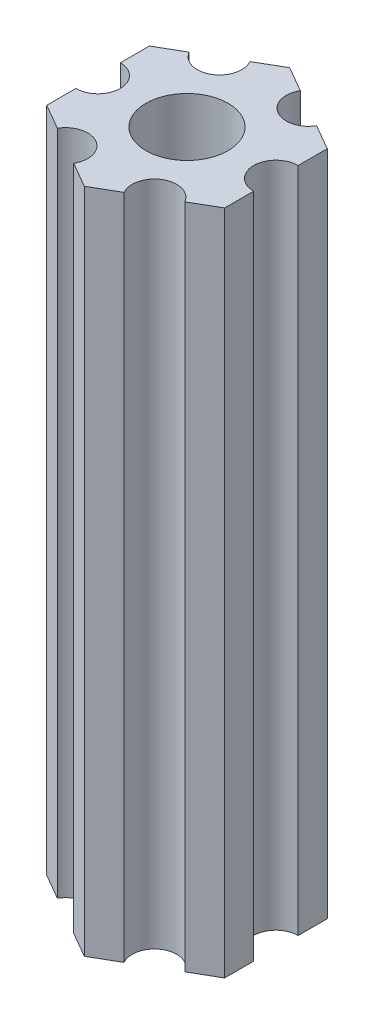
ISO-10303-21;
HEADER;
FILE_DESCRIPTION(('STEP AP214'),'2;1');
FILE_NAME('part.step','',(''),(''),'','','');
FILE_SCHEMA(('AUTOMOTIVE_DESIGN { 1 0 10303 214 1 1 1 1 }'));
ENDSEC;
DATA;
#1=APPLICATION_CONTEXT('core data for automotive mechanical design processes');
#2=APPLICATION_PROTOCOL_DEFINITION('international standard','automotive_design',2000,#1);
#3=PRODUCT_CONTEXT('',#1,'mechanical');
#4=PRODUCT('Part','Part','',(#3));
#5=PRODUCT_RELATED_PRODUCT_CATEGORY('part','',(#4));
#6=PRODUCT_DEFINITION_FORMATION('','',#4);
#7=PRODUCT_DEFINITION_CONTEXT('part definition',#1,'design');
#8=PRODUCT_DEFINITION('design','',#6,#7);
#9=PRODUCT_DEFINITION_SHAPE('','',#8);
#10=(LENGTH_UNIT() NAMED_UNIT(*) SI_UNIT(.MILLI.,.METRE.));
#11=(NAMED_UNIT(*) PLANE_ANGLE_UNIT() SI_UNIT($,.RADIAN.));
#12=(NAMED_UNIT(*) SI_UNIT($,.STERADIAN.) SOLID_ANGLE_UNIT());
#13=UNCERTAINTY_MEASURE_WITH_UNIT(LENGTH_MEASURE(1.E-05),#10,'distance_accuracy_value','');
#14=(GEOMETRIC_REPRESENTATION_CONTEXT(3) GLOBAL_UNCERTAINTY_ASSIGNED_CONTEXT((#13)) GLOBAL_UNIT_ASSIGNED_CONTEXT((#10,
#11,#12)) REPRESENTATION_CONTEXT('',''));
#15=CARTESIAN_POINT('',(0.,0.,0.));
#16=DIRECTION('',(0.,0.,1.));
#17=DIRECTION('',(1.,0.,0.));
#18=AXIS2_PLACEMENT_3D('',#15,#16,#17);
#19=CARTESIAN_POINT('',(3.175,-47.625,5.49926131403119));
#20=DIRECTION('',(0.,1.,0.));
#21=DIRECTION('',(-0.866025403784439,0.,0.5));
#22=AXIS2_PLACEMENT_3D('',#19,#20,#21);
#23=CYLINDRICAL_SURFACE('',#22,1.5875);
#24=DIRECTION('',(0.,-1.,0.));
#25=VECTOR('',#24,1.);
#26=CARTESIAN_POINT('',(1.8001846714922,-47.625,6.29301131403118));
#27=LINE('',#26,#25);
#28=CARTESIAN_POINT('',(1.8001846714922,0.,6.29301131403119));
#29=VERTEX_POINT('',#28);
#30=CARTESIAN_POINT('',(1.8001846714922,-47.625,6.29301131403119));
#31=VERTEX_POINT('',#30);
#32=EDGE_CURVE('E380',#29,#31,#27,.T.);
#33=ORIENTED_EDGE('',*,*,#32,.T.);
#34=CARTESIAN_POINT('',(3.175,-47.625,5.49926131403119));
#35=DIRECTION('',(0.,-1.,0.));
#36=DIRECTION('',(0.866025403784439,0.,-0.5));
#37=AXIS2_PLACEMENT_3D('',#34,#35,#36);
#38=CIRCLE('',#37,1.5875);
#39=CARTESIAN_POINT('',(4.5498153285078,-47.625,4.70551131403118));
#40=VERTEX_POINT('',#39);
#41=EDGE_CURVE('E247',#31,#40,#38,.T.);
#42=ORIENTED_EDGE('',*,*,#41,.T.);
#43=DIRECTION('',(0.,1.,0.));
#44=VECTOR('',#43,1.);
#45=CARTESIAN_POINT('',(4.5498153285078,-47.625,4.70551131403118));
#46=LINE('',#45,#44);
#47=CARTESIAN_POINT('',(4.5498153285078,0.,4.70551131403119));
#48=VERTEX_POINT('',#47);
#49=EDGE_CURVE('E387',#40,#48,#46,.T.);
#50=ORIENTED_EDGE('',*,*,#49,.T.);
#51=CARTESIAN_POINT('',(3.175,0.,5.49926131403119));
#52=DIRECTION('',(0.,-1.,0.));
#53=DIRECTION('',(0.866025403784439,0.,-0.5));
#54=AXIS2_PLACEMENT_3D('',#51,#52,#53);
#55=CIRCLE('',#54,1.5875);
#56=EDGE_CURVE('E308',#29,#48,#55,.T.);
#57=ORIENTED_EDGE('',*,*,#56,.F.);
#58=EDGE_LOOP('',(#33,#42,#50,#57));
#59=FACE_BOUND('',#58,.T.);
#60=ADVANCED_FACE('F17',(#59),#23,.F.);
#61=CARTESIAN_POINT('',(-3.175,-47.625,5.49926131403119));
#62=DIRECTION('',(0.,1.,0.));
#63=DIRECTION('',(-0.866025403784439,0.,-0.5));
#64=AXIS2_PLACEMENT_3D('',#61,#62,#63);
#65=CYLINDRICAL_SURFACE('',#64,1.5875);
#66=DIRECTION('',(0.,-1.,0.));
#67=VECTOR('',#66,1.);
#68=CARTESIAN_POINT('',(-4.5498153285078,-47.625,4.70551131403119));
#69=LINE('',#68,#67);
#70=CARTESIAN_POINT('',(-4.5498153285078,0.,4.70551131403119));
#71=VERTEX_POINT('',#70);
#72=CARTESIAN_POINT('',(-4.5498153285078,-47.625,4.70551131403119));
#73=VERTEX_POINT('',#72);
#74=EDGE_CURVE('E232',#71,#73,#69,.T.);
#75=ORIENTED_EDGE('',*,*,#74,.T.);
#76=CARTESIAN_POINT('',(-3.175,-47.625,5.49926131403119));
#77=DIRECTION('',(0.,-1.,0.));
#78=DIRECTION('',(0.866025403784439,0.,0.5));
#79=AXIS2_PLACEMENT_3D('',#76,#77,#78);
#80=CIRCLE('',#79,1.5875);
#81=CARTESIAN_POINT('',(-1.8001846714922,-47.625,6.29301131403119));
#82=VERTEX_POINT('',#81);
#83=EDGE_CURVE('E284',#73,#82,#80,.T.);
#84=ORIENTED_EDGE('',*,*,#83,.T.);
#85=DIRECTION('',(0.,1.,0.));
#86=VECTOR('',#85,1.);
#87=CARTESIAN_POINT('',(-1.8001846714922,-47.625,6.29301131403119));
#88=LINE('',#87,#86);
#89=CARTESIAN_POINT('',(-1.8001846714922,0.,6.29301131403119));
#90=VERTEX_POINT('',#89);
#91=EDGE_CURVE('E236',#82,#90,#88,.T.);
#92=ORIENTED_EDGE('',*,*,#91,.T.);
#93=CARTESIAN_POINT('',(-3.175,0.,5.49926131403119));
#94=DIRECTION('',(0.,-1.,0.));
#95=DIRECTION('',(0.866025403784439,0.,0.5));
#96=AXIS2_PLACEMENT_3D('',#93,#94,#95);
#97=CIRCLE('',#96,1.5875);
#98=EDGE_CURVE('E11',#71,#90,#97,.T.);
#99=ORIENTED_EDGE('',*,*,#98,.F.);
#100=EDGE_LOOP('',(#75,#84,#92,#99));
#101=FACE_BOUND('',#100,.T.);
#102=ADVANCED_FACE('F453',(#101),#65,.F.);
#103=CARTESIAN_POINT('',(-6.35,-47.625,0.));
#104=DIRECTION('',(0.,1.,0.));
#105=DIRECTION('',(0.,0.,-1.));
#106=AXIS2_PLACEMENT_3D('',#103,#104,#105);
#107=CYLINDRICAL_SURFACE('',#106,1.5875);
#108=DIRECTION('',(0.,-1.,0.));
#109=VECTOR('',#108,1.);
#110=CARTESIAN_POINT('',(-6.35,-47.625,-1.5875));
#111=LINE('',#110,#109);
#112=CARTESIAN_POINT('',(-6.35,0.,-1.5875));
#113=VERTEX_POINT('',#112);
#114=CARTESIAN_POINT('',(-6.35,-47.625,-1.5875));
#115=VERTEX_POINT('',#114);
#116=EDGE_CURVE('E192',#113,#115,#111,.T.);
#117=ORIENTED_EDGE('',*,*,#116,.T.);
#118=CARTESIAN_POINT('',(-6.35,-47.625,0.));
#119=DIRECTION('',(0.,-1.,0.));
#120=DIRECTION('',(0.,0.,1.));
#121=AXIS2_PLACEMENT_3D('',#118,#119,#120);
#122=CIRCLE('',#121,1.5875);
#123=CARTESIAN_POINT('',(-6.35,-47.625,1.5875));
#124=VERTEX_POINT('',#123);
#125=EDGE_CURVE('E287',#115,#124,#122,.T.);
#126=ORIENTED_EDGE('',*,*,#125,.T.);
#127=DIRECTION('',(0.,1.,0.));
#128=VECTOR('',#127,1.);
#129=CARTESIAN_POINT('',(-6.35,-47.625,1.5875));
#130=LINE('',#129,#128);
#131=CARTESIAN_POINT('',(-6.35,0.,1.5875));
#132=VERTEX_POINT('',#131);
#133=EDGE_CURVE('E194',#124,#132,#130,.T.);
#134=ORIENTED_EDGE('',*,*,#133,.T.);
#135=CARTESIAN_POINT('',(-6.35,0.,0.));
#136=DIRECTION('',(0.,-1.,0.));
#137=DIRECTION('',(0.,0.,1.));
#138=AXIS2_PLACEMENT_3D('',#135,#136,#137);
#139=CIRCLE('',#138,1.5875);
#140=EDGE_CURVE('E25',#113,#132,#139,.T.);
#141=ORIENTED_EDGE('',*,*,#140,.F.);
#142=EDGE_LOOP('',(#117,#126,#134,#141));
#143=FACE_BOUND('',#142,.T.);
#144=ADVANCED_FACE('F190',(#143),#107,.F.);
#145=CARTESIAN_POINT('',(-3.175,-47.625,-5.49926131403118));
#146=DIRECTION('',(0.,1.,0.));
#147=DIRECTION('',(0.866025403784439,0.,-0.5));
#148=AXIS2_PLACEMENT_3D('',#145,#146,#147);
#149=CYLINDRICAL_SURFACE('',#148,1.5875);
#150=DIRECTION('',(0.,-1.,0.));
#151=VECTOR('',#150,1.);
#152=CARTESIAN_POINT('',(-1.8001846714922,-47.625,-6.29301131403118));
#153=LINE('',#152,#151);
#154=CARTESIAN_POINT('',(-1.8001846714922,0.,-6.29301131403118));
#155=VERTEX_POINT('',#154);
#156=CARTESIAN_POINT('',(-1.8001846714922,-47.625,-6.29301131403118));
#157=VERTEX_POINT('',#156);
#158=EDGE_CURVE('E256',#155,#157,#153,.T.);
#159=ORIENTED_EDGE('',*,*,#158,.T.);
#160=CARTESIAN_POINT('',(-3.175,-47.625,-5.49926131403118));
#161=DIRECTION('',(0.,-1.,0.));
#162=DIRECTION('',(-0.866025403784439,0.,0.5));
#163=AXIS2_PLACEMENT_3D('',#160,#161,#162);
#164=CIRCLE('',#163,1.5875);
#165=CARTESIAN_POINT('',(-4.5498153285078,-47.625,-4.70551131403118));
#166=VERTEX_POINT('',#165);
#167=EDGE_CURVE('E349',#157,#166,#164,.T.);
#168=ORIENTED_EDGE('',*,*,#167,.T.);
#169=DIRECTION('',(0.,1.,0.));
#170=VECTOR('',#169,1.);
#171=CARTESIAN_POINT('',(-4.5498153285078,-47.625,-4.70551131403118));
#172=LINE('',#171,#170);
#173=CARTESIAN_POINT('',(-4.5498153285078,0.,-4.70551131403118));
#174=VERTEX_POINT('',#173);
#175=EDGE_CURVE('E283',#166,#174,#172,.T.);
#176=ORIENTED_EDGE('',*,*,#175,.T.);
#177=CARTESIAN_POINT('',(-3.175,0.,-5.49926131403118));
#178=DIRECTION('',(0.,-1.,0.));
#179=DIRECTION('',(-0.866025403784439,0.,0.5));
#180=AXIS2_PLACEMENT_3D('',#177,#178,#179);
#181=CIRCLE('',#180,1.5875);
#182=EDGE_CURVE('E198',#155,#174,#181,.T.);
#183=ORIENTED_EDGE('',*,*,#182,.F.);
#184=EDGE_LOOP('',(#159,#168,#176,#183));
#185=FACE_BOUND('',#184,.T.);
#186=ADVANCED_FACE('F370',(#185),#149,.F.);
#187=CARTESIAN_POINT('',(3.175,-47.625,-5.49926131403119));
#188=DIRECTION('',(0.,1.,0.));
#189=DIRECTION('',(0.866025403784439,0.,0.5));
#190=AXIS2_PLACEMENT_3D('',#187,#188,#189);
#191=CYLINDRICAL_SURFACE('',#190,1.5875);
#192=DIRECTION('',(0.,-1.,0.));
#193=VECTOR('',#192,1.);
#194=CARTESIAN_POINT('',(4.5498153285078,-47.625,-4.70551131403119));
#195=LINE('',#194,#193);
#196=CARTESIAN_POINT('',(4.5498153285078,0.,-4.70551131403119));
#197=VERTEX_POINT('',#196);
#198=CARTESIAN_POINT('',(4.5498153285078,-47.625,-4.70551131403119));
#199=VERTEX_POINT('',#198);
#200=EDGE_CURVE('E305',#197,#199,#195,.T.);
#201=ORIENTED_EDGE('',*,*,#200,.T.);
#202=CARTESIAN_POINT('',(3.175,-47.625,-5.49926131403119));
#203=DIRECTION('',(0.,-1.,0.));
#204=DIRECTION('',(-0.866025403784439,0.,-0.5));
#205=AXIS2_PLACEMENT_3D('',#202,#203,#204);
#206=CIRCLE('',#205,1.5875);
#207=CARTESIAN_POINT('',(1.8001846714922,-47.625,-6.29301131403119));
#208=VERTEX_POINT('',#207);
#209=EDGE_CURVE('E352',#199,#208,#206,.T.);
#210=ORIENTED_EDGE('',*,*,#209,.T.);
#211=DIRECTION('',(0.,1.,0.));
#212=VECTOR('',#211,1.);
#213=CARTESIAN_POINT('',(1.8001846714922,-47.625,-6.29301131403119));
#214=LINE('',#213,#212);
#215=CARTESIAN_POINT('',(1.8001846714922,0.,-6.29301131403119));
#216=VERTEX_POINT('',#215);
#217=EDGE_CURVE('E327',#208,#216,#214,.T.);
#218=ORIENTED_EDGE('',*,*,#217,.T.);
#219=CARTESIAN_POINT('',(3.175,0.,-5.49926131403119));
#220=DIRECTION('',(0.,-1.,0.));
#221=DIRECTION('',(-0.866025403784439,0.,-0.5));
#222=AXIS2_PLACEMENT_3D('',#219,#220,#221);
#223=CIRCLE('',#222,1.5875);
#224=EDGE_CURVE('E359',#197,#216,#223,.T.);
#225=ORIENTED_EDGE('',*,*,#224,.F.);
#226=EDGE_LOOP('',(#201,#210,#218,#225));
#227=FACE_BOUND('',#226,.T.);
#228=ADVANCED_FACE('F419',(#227),#191,.F.);
#229=CARTESIAN_POINT('',(6.35,-47.625,0.));
#230=DIRECTION('',(0.,1.,0.));
#231=DIRECTION('',(0.,0.,1.));
#232=AXIS2_PLACEMENT_3D('',#229,#230,#231);
#233=CYLINDRICAL_SURFACE('',#232,1.5875);
#234=DIRECTION('',(0.,-1.,0.));
#235=VECTOR('',#234,1.);
#236=CARTESIAN_POINT('',(6.35,-47.625,1.5875));
#237=LINE('',#236,#235);
#238=CARTESIAN_POINT('',(6.35,0.,1.5875));
#239=VERTEX_POINT('',#238);
#240=CARTESIAN_POINT('',(6.35,-47.625,1.5875));
#241=VERTEX_POINT('',#240);
#242=EDGE_CURVE('E319',#239,#241,#237,.T.);
#243=ORIENTED_EDGE('',*,*,#242,.T.);
#244=CARTESIAN_POINT('',(6.35,-47.625,0.));
#245=DIRECTION('',(0.,-1.,0.));
#246=DIRECTION('',(0.,0.,-1.));
#247=AXIS2_PLACEMENT_3D('',#244,#245,#246);
#248=CIRCLE('',#247,1.5875);
#249=CARTESIAN_POINT('',(6.35,-47.625,-1.5875));
#250=VERTEX_POINT('',#249);
#251=EDGE_CURVE('E318',#241,#250,#248,.T.);
#252=ORIENTED_EDGE('',*,*,#251,.T.);
#253=DIRECTION('',(0.,1.,0.));
#254=VECTOR('',#253,1.);
#255=CARTESIAN_POINT('',(6.35,-47.625,-1.5875));
#256=LINE('',#255,#254);
#257=CARTESIAN_POINT('',(6.35,0.,-1.5875));
#258=VERTEX_POINT('',#257);
#259=EDGE_CURVE('E291',#250,#258,#256,.T.);
#260=ORIENTED_EDGE('',*,*,#259,.T.);
#261=CARTESIAN_POINT('',(6.35,0.,0.));
#262=DIRECTION('',(0.,-1.,0.));
#263=DIRECTION('',(0.,0.,-1.));
#264=AXIS2_PLACEMENT_3D('',#261,#262,#263);
#265=CIRCLE('',#264,1.5875);
#266=EDGE_CURVE('E311',#239,#258,#265,.T.);
#267=ORIENTED_EDGE('',*,*,#266,.F.);
#268=EDGE_LOOP('',(#243,#252,#260,#267));
#269=FACE_BOUND('',#268,.T.);
#270=ADVANCED_FACE('F430',(#269),#233,.F.);
#271=CARTESIAN_POINT('',(0.,-47.625,0.));
#272=DIRECTION('',(0.,1.,0.));
#273=DIRECTION('',(0.,0.,1.));
#274=AXIS2_PLACEMENT_3D('',#271,#272,#273);
#275=CYLINDRICAL_SURFACE('',#274,2.9337);
#276=CARTESIAN_POINT('',(0.,0.,0.));
#277=DIRECTION('',(0.,-1.,0.));
#278=DIRECTION('',(0.,0.,-1.));
#279=AXIS2_PLACEMENT_3D('',#276,#277,#278);
#280=CIRCLE('',#279,2.9337);
#281=CARTESIAN_POINT('',(0.,0.,-2.9337));
#282=VERTEX_POINT('',#281);
#283=EDGE_CURVE('E35',#282,#282,#280,.T.);
#284=ORIENTED_EDGE('',*,*,#283,.F.);
#285=EDGE_LOOP('',(#284));
#286=FACE_BOUND('',#285,.T.);
#287=CARTESIAN_POINT('',(0.,-47.625,0.));
#288=DIRECTION('',(0.,-1.,0.));
#289=DIRECTION('',(0.,0.,-1.));
#290=AXIS2_PLACEMENT_3D('',#287,#288,#289);
#291=CIRCLE('',#290,2.9337);
#292=CARTESIAN_POINT('',(0.,-47.625,-2.9337));
#293=VERTEX_POINT('',#292);
#294=EDGE_CURVE('E42',#293,#293,#291,.T.);
#295=ORIENTED_EDGE('',*,*,#294,.T.);
#296=EDGE_LOOP('',(#295));
#297=FACE_BOUND('',#296,.T.);
#298=ADVANCED_FACE('F496',(#286,#297),#275,.F.);
#299=CARTESIAN_POINT('',(0.,0.,0.));
#300=DIRECTION('',(0.,-1.,0.));
#301=DIRECTION('',(0.,0.,-1.));
#302=AXIS2_PLACEMENT_3D('',#299,#300,#301);
#303=PLANE('',#302);
#304=DIRECTION('',(-0.866025403784439,0.,0.5));
#305=VECTOR('',#304,1.);
#306=CARTESIAN_POINT('',(3.175,0.,5.49926131403118));
#307=LINE('',#306,#305);
#308=CARTESIAN_POINT('',(0.,0.,7.33234841870825));
#309=VERTEX_POINT('',#308);
#310=EDGE_CURVE('E383',#29,#309,#307,.T.);
#311=ORIENTED_EDGE('',*,*,#310,.F.);
#312=ORIENTED_EDGE('',*,*,#56,.T.);
#313=DIRECTION('',(-0.866025403784439,0.,0.5));
#314=VECTOR('',#313,1.);
#315=CARTESIAN_POINT('',(3.175,0.,5.49926131403118));
#316=LINE('',#315,#314);
#317=CARTESIAN_POINT('',(6.35,0.,3.66617420935412));
#318=VERTEX_POINT('',#317);
#319=EDGE_CURVE('E229',#318,#48,#316,.T.);
#320=ORIENTED_EDGE('',*,*,#319,.F.);
#321=DIRECTION('',(0.,0.,1.));
#322=VECTOR('',#321,1.);
#323=CARTESIAN_POINT('',(6.35,0.,0.));
#324=LINE('',#323,#322);
#325=EDGE_CURVE('E292',#239,#318,#324,.T.);
#326=ORIENTED_EDGE('',*,*,#325,.F.);
#327=ORIENTED_EDGE('',*,*,#266,.T.);
#328=DIRECTION('',(0.,0.,1.));
#329=VECTOR('',#328,1.);
#330=CARTESIAN_POINT('',(6.35,0.,0.));
#331=LINE('',#330,#329);
#332=CARTESIAN_POINT('',(6.35,0.,-3.66617420935413));
#333=VERTEX_POINT('',#332);
#334=EDGE_CURVE('E248',#333,#258,#331,.T.);
#335=ORIENTED_EDGE('',*,*,#334,.F.);
#336=DIRECTION('',(0.866025403784439,0.,0.5));
#337=VECTOR('',#336,1.);
#338=CARTESIAN_POINT('',(3.175,0.,-5.49926131403119));
#339=LINE('',#338,#337);
#340=EDGE_CURVE('E300',#197,#333,#339,.T.);
#341=ORIENTED_EDGE('',*,*,#340,.F.);
#342=ORIENTED_EDGE('',*,*,#224,.T.);
#343=DIRECTION('',(0.866025403784439,0.,0.5));
#344=VECTOR('',#343,1.);
#345=CARTESIAN_POINT('',(3.175,0.,-5.49926131403119));
#346=LINE('',#345,#344);
#347=CARTESIAN_POINT('',(0.,0.,-7.33234841870825));
#348=VERTEX_POINT('',#347);
#349=EDGE_CURVE('E323',#348,#216,#346,.T.);
#350=ORIENTED_EDGE('',*,*,#349,.F.);
#351=DIRECTION('',(0.866025403784439,0.,-0.5));
#352=VECTOR('',#351,1.);
#353=CARTESIAN_POINT('',(-3.175,0.,-5.49926131403119));
#354=LINE('',#353,#352);
#355=EDGE_CURVE('E259',#155,#348,#354,.T.);
#356=ORIENTED_EDGE('',*,*,#355,.F.);
#357=ORIENTED_EDGE('',*,*,#182,.T.);
#358=DIRECTION('',(0.866025403784439,0.,-0.5));
#359=VECTOR('',#358,1.);
#360=CARTESIAN_POINT('',(-3.175,0.,-5.49926131403119));
#361=LINE('',#360,#359);
#362=CARTESIAN_POINT('',(-6.35,0.,-3.66617420935412));
#363=VERTEX_POINT('',#362);
#364=EDGE_CURVE('E204',#363,#174,#361,.T.);
#365=ORIENTED_EDGE('',*,*,#364,.F.);
#366=DIRECTION('',(0.,0.,-1.));
#367=VECTOR('',#366,1.);
#368=CARTESIAN_POINT('',(-6.35,0.,0.));
#369=LINE('',#368,#367);
#370=EDGE_CURVE('E200',#113,#363,#369,.T.);
#371=ORIENTED_EDGE('',*,*,#370,.F.);
#372=ORIENTED_EDGE('',*,*,#140,.T.);
#373=DIRECTION('',(0.,0.,-1.));
#374=VECTOR('',#373,1.);
#375=CARTESIAN_POINT('',(-6.35,0.,0.));
#376=LINE('',#375,#374);
#377=CARTESIAN_POINT('',(-6.35,0.,3.66617420935413));
#378=VERTEX_POINT('',#377);
#379=EDGE_CURVE('E260',#378,#132,#376,.T.);
#380=ORIENTED_EDGE('',*,*,#379,.F.);
#381=DIRECTION('',(-0.866025403784439,0.,-0.5));
#382=VECTOR('',#381,1.);
#383=CARTESIAN_POINT('',(-3.175,0.,5.49926131403119));
#384=LINE('',#383,#382);
#385=EDGE_CURVE('E240',#71,#378,#384,.T.);
#386=ORIENTED_EDGE('',*,*,#385,.F.);
#387=ORIENTED_EDGE('',*,*,#98,.T.);
#388=DIRECTION('',(-0.866025403784439,0.,-0.5));
#389=VECTOR('',#388,1.);
#390=CARTESIAN_POINT('',(-3.175,0.,5.49926131403119));
#391=LINE('',#390,#389);
#392=EDGE_CURVE('E216',#309,#90,#391,.T.);
#393=ORIENTED_EDGE('',*,*,#392,.F.);
#394=EDGE_LOOP('',(#311,#312,#320,#326,#327,#335,#341,#342,#350,#356,#357,#365,#371,#372,#380,
#386,#387,#393));
#395=FACE_BOUND('',#394,.T.);
#396=ORIENTED_EDGE('',*,*,#283,.T.);
#397=EDGE_LOOP('',(#396));
#398=FACE_BOUND('',#397,.T.);
#399=ADVANCED_FACE('F202',(#395,#398),#303,.F.);
#400=CARTESIAN_POINT('',(0.,-47.625,0.));
#401=DIRECTION('',(0.,-1.,0.));
#402=DIRECTION('',(0.,0.,-1.));
#403=AXIS2_PLACEMENT_3D('',#400,#401,#402);
#404=PLANE('',#403);
#405=ORIENTED_EDGE('',*,*,#41,.F.);
#406=DIRECTION('',(-0.866025403784439,0.,0.5));
#407=VECTOR('',#406,1.);
#408=CARTESIAN_POINT('',(3.175,-47.625,5.49926131403118));
#409=LINE('',#408,#407);
#410=CARTESIAN_POINT('',(0.,-47.625,7.33234841870825));
#411=VERTEX_POINT('',#410);
#412=EDGE_CURVE('E392',#31,#411,#409,.T.);
#413=ORIENTED_EDGE('',*,*,#412,.T.);
#414=DIRECTION('',(-0.866025403784439,0.,-0.5));
#415=VECTOR('',#414,1.);
#416=CARTESIAN_POINT('',(-3.175,-47.625,5.49926131403119));
#417=LINE('',#416,#415);
#418=EDGE_CURVE('E223',#411,#82,#417,.T.);
#419=ORIENTED_EDGE('',*,*,#418,.T.);
#420=ORIENTED_EDGE('',*,*,#83,.F.);
#421=DIRECTION('',(-0.866025403784439,0.,-0.5));
#422=VECTOR('',#421,1.);
#423=CARTESIAN_POINT('',(-3.175,-47.625,5.49926131403119));
#424=LINE('',#423,#422);
#425=CARTESIAN_POINT('',(-6.35,-47.625,3.66617420935413));
#426=VERTEX_POINT('',#425);
#427=EDGE_CURVE('E252',#73,#426,#424,.T.);
#428=ORIENTED_EDGE('',*,*,#427,.T.);
#429=DIRECTION('',(0.,0.,-1.));
#430=VECTOR('',#429,1.);
#431=CARTESIAN_POINT('',(-6.35,-47.625,0.));
#432=LINE('',#431,#430);
#433=EDGE_CURVE('E266',#426,#124,#432,.T.);
#434=ORIENTED_EDGE('',*,*,#433,.T.);
#435=ORIENTED_EDGE('',*,*,#125,.F.);
#436=DIRECTION('',(0.,0.,-1.));
#437=VECTOR('',#436,1.);
#438=CARTESIAN_POINT('',(-6.35,-47.625,0.));
#439=LINE('',#438,#437);
#440=CARTESIAN_POINT('',(-6.35,-47.625,-3.66617420935412));
#441=VERTEX_POINT('',#440);
#442=EDGE_CURVE('E214',#115,#441,#439,.T.);
#443=ORIENTED_EDGE('',*,*,#442,.T.);
#444=DIRECTION('',(0.866025403784439,0.,-0.5));
#445=VECTOR('',#444,1.);
#446=CARTESIAN_POINT('',(-3.175,-47.625,-5.49926131403119));
#447=LINE('',#446,#445);
#448=EDGE_CURVE('E296',#441,#166,#447,.T.);
#449=ORIENTED_EDGE('',*,*,#448,.T.);
#450=ORIENTED_EDGE('',*,*,#167,.F.);
#451=DIRECTION('',(0.866025403784439,0.,-0.5));
#452=VECTOR('',#451,1.);
#453=CARTESIAN_POINT('',(-3.175,-47.625,-5.49926131403119));
#454=LINE('',#453,#452);
#455=CARTESIAN_POINT('',(0.,-47.625,-7.33234841870825));
#456=VERTEX_POINT('',#455);
#457=EDGE_CURVE('E279',#157,#456,#454,.T.);
#458=ORIENTED_EDGE('',*,*,#457,.T.);
#459=DIRECTION('',(0.866025403784439,0.,0.5));
#460=VECTOR('',#459,1.);
#461=CARTESIAN_POINT('',(3.175,-47.625,-5.49926131403119));
#462=LINE('',#461,#460);
#463=EDGE_CURVE('E331',#456,#208,#462,.T.);
#464=ORIENTED_EDGE('',*,*,#463,.T.);
#465=ORIENTED_EDGE('',*,*,#209,.F.);
#466=DIRECTION('',(0.866025403784439,0.,0.5));
#467=VECTOR('',#466,1.);
#468=CARTESIAN_POINT('',(3.175,-47.625,-5.49926131403119));
#469=LINE('',#468,#467);
#470=CARTESIAN_POINT('',(6.35,-47.625,-3.66617420935413));
#471=VERTEX_POINT('',#470);
#472=EDGE_CURVE('E315',#199,#471,#469,.T.);
#473=ORIENTED_EDGE('',*,*,#472,.T.);
#474=DIRECTION('',(0.,0.,1.));
#475=VECTOR('',#474,1.);
#476=CARTESIAN_POINT('',(6.35,-47.625,0.));
#477=LINE('',#476,#475);
#478=EDGE_CURVE('E338',#471,#250,#477,.T.);
#479=ORIENTED_EDGE('',*,*,#478,.T.);
#480=ORIENTED_EDGE('',*,*,#251,.F.);
#481=DIRECTION('',(0.,0.,1.));
#482=VECTOR('',#481,1.);
#483=CARTESIAN_POINT('',(6.35,-47.625,0.));
#484=LINE('',#483,#482);
#485=CARTESIAN_POINT('',(6.35,-47.625,3.66617420935412));
#486=VERTEX_POINT('',#485);
#487=EDGE_CURVE('E288',#241,#486,#484,.T.);
#488=ORIENTED_EDGE('',*,*,#487,.T.);
#489=DIRECTION('',(-0.866025403784439,0.,0.5));
#490=VECTOR('',#489,1.);
#491=CARTESIAN_POINT('',(3.175,-47.625,5.49926131403118));
#492=LINE('',#491,#490);
#493=EDGE_CURVE('E391',#486,#40,#492,.T.);
#494=ORIENTED_EDGE('',*,*,#493,.T.);
#495=EDGE_LOOP('',(#405,#413,#419,#420,#428,#434,#435,#443,#449,#450,#458,#464,#465,#473,#479,
#480,#488,#494));
#496=FACE_BOUND('',#495,.T.);
#497=ORIENTED_EDGE('',*,*,#294,.F.);
#498=EDGE_LOOP('',(#497));
#499=FACE_BOUND('',#498,.T.);
#500=ADVANCED_FACE('F373',(#496,#499),#404,.T.);
#501=CARTESIAN_POINT('',(6.35,-47.625,0.));
#502=DIRECTION('',(-1.,0.,0.));
#503=DIRECTION('',(0.,1.,0.));
#504=AXIS2_PLACEMENT_3D('',#501,#502,#503);
#505=PLANE('',#504);
#506=ORIENTED_EDGE('',*,*,#259,.F.);
#507=ORIENTED_EDGE('',*,*,#478,.F.);
#508=DIRECTION('',(0.,1.,0.));
#509=VECTOR('',#508,1.);
#510=CARTESIAN_POINT('',(6.35,-47.625,-3.66617420935413));
#511=LINE('',#510,#509);
#512=EDGE_CURVE('E304',#471,#333,#511,.T.);
#513=ORIENTED_EDGE('',*,*,#512,.T.);
#514=ORIENTED_EDGE('',*,*,#334,.T.);
#515=EDGE_LOOP('',(#506,#507,#513,#514));
#516=FACE_BOUND('',#515,.T.);
#517=ADVANCED_FACE('F428',(#516),#505,.F.);
#518=CARTESIAN_POINT('',(6.35,-47.625,0.));
#519=DIRECTION('',(-1.,0.,0.));
#520=DIRECTION('',(0.,1.,0.));
#521=AXIS2_PLACEMENT_3D('',#518,#519,#520);
#522=PLANE('',#521);
#523=ORIENTED_EDGE('',*,*,#242,.F.);
#524=ORIENTED_EDGE('',*,*,#325,.T.);
#525=DIRECTION('',(0.,1.,0.));
#526=VECTOR('',#525,1.);
#527=CARTESIAN_POINT('',(6.35,-47.625,3.66617420935412));
#528=LINE('',#527,#526);
#529=EDGE_CURVE('E227',#486,#318,#528,.T.);
#530=ORIENTED_EDGE('',*,*,#529,.F.);
#531=ORIENTED_EDGE('',*,*,#487,.F.);
#532=EDGE_LOOP('',(#523,#524,#530,#531));
#533=FACE_BOUND('',#532,.T.);
#534=ADVANCED_FACE('F434',(#533),#522,.F.);
#535=CARTESIAN_POINT('',(3.175,-47.625,-5.49926131403119));
#536=DIRECTION('',(-0.5,0.,0.866025403784439));
#537=DIRECTION('',(0.,1.,0.));
#538=AXIS2_PLACEMENT_3D('',#535,#536,#537);
#539=PLANE('',#538);
#540=ORIENTED_EDGE('',*,*,#217,.F.);
#541=ORIENTED_EDGE('',*,*,#463,.F.);
#542=DIRECTION('',(0.,1.,0.));
#543=VECTOR('',#542,1.);
#544=CARTESIAN_POINT('',(0.,-47.625,-7.33234841870825));
#545=LINE('',#544,#543);
#546=EDGE_CURVE('E275',#456,#348,#545,.T.);
#547=ORIENTED_EDGE('',*,*,#546,.T.);
#548=ORIENTED_EDGE('',*,*,#349,.T.);
#549=EDGE_LOOP('',(#540,#541,#547,#548));
#550=FACE_BOUND('',#549,.T.);
#551=ADVANCED_FACE('F417',(#550),#539,.F.);
#552=CARTESIAN_POINT('',(3.175,-47.625,-5.49926131403119));
#553=DIRECTION('',(-0.5,0.,0.866025403784439));
#554=DIRECTION('',(0.,1.,0.));
#555=AXIS2_PLACEMENT_3D('',#552,#553,#554);
#556=PLANE('',#555);
#557=ORIENTED_EDGE('',*,*,#200,.F.);
#558=ORIENTED_EDGE('',*,*,#340,.T.);
#559=ORIENTED_EDGE('',*,*,#512,.F.);
#560=ORIENTED_EDGE('',*,*,#472,.F.);
#561=EDGE_LOOP('',(#557,#558,#559,#560));
#562=FACE_BOUND('',#561,.T.);
#563=ADVANCED_FACE('F423',(#562),#556,.F.);
#564=CARTESIAN_POINT('',(-3.175,-47.625,-5.49926131403119));
#565=DIRECTION('',(0.5,0.,0.866025403784439));
#566=DIRECTION('',(0.,-1.,0.));
#567=AXIS2_PLACEMENT_3D('',#564,#565,#566);
#568=PLANE('',#567);
#569=ORIENTED_EDGE('',*,*,#175,.F.);
#570=ORIENTED_EDGE('',*,*,#448,.F.);
#571=DIRECTION('',(0.,1.,0.));
#572=VECTOR('',#571,1.);
#573=CARTESIAN_POINT('',(-6.35,-47.625,-3.66617420935412));
#574=LINE('',#573,#572);
#575=EDGE_CURVE('E209',#441,#363,#574,.T.);
#576=ORIENTED_EDGE('',*,*,#575,.T.);
#577=ORIENTED_EDGE('',*,*,#364,.T.);
#578=EDGE_LOOP('',(#569,#570,#576,#577));
#579=FACE_BOUND('',#578,.T.);
#580=ADVANCED_FACE('F369',(#579),#568,.F.);
#581=CARTESIAN_POINT('',(-3.175,-47.625,-5.49926131403119));
#582=DIRECTION('',(0.5,0.,0.866025403784439));
#583=DIRECTION('',(0.,-1.,0.));
#584=AXIS2_PLACEMENT_3D('',#581,#582,#583);
#585=PLANE('',#584);
#586=ORIENTED_EDGE('',*,*,#158,.F.);
#587=ORIENTED_EDGE('',*,*,#355,.T.);
#588=ORIENTED_EDGE('',*,*,#546,.F.);
#589=ORIENTED_EDGE('',*,*,#457,.F.);
#590=EDGE_LOOP('',(#586,#587,#588,#589));
#591=FACE_BOUND('',#590,.T.);
#592=ADVANCED_FACE('F465',(#591),#585,.F.);
#593=CARTESIAN_POINT('',(-6.35,-47.625,0.));
#594=DIRECTION('',(1.,0.,0.));
#595=DIRECTION('',(0.,1.,0.));
#596=AXIS2_PLACEMENT_3D('',#593,#594,#595);
#597=PLANE('',#596);
#598=ORIENTED_EDGE('',*,*,#133,.F.);
#599=ORIENTED_EDGE('',*,*,#433,.F.);
#600=DIRECTION('',(0.,1.,0.));
#601=VECTOR('',#600,1.);
#602=CARTESIAN_POINT('',(-6.35,-47.625,3.66617420935413));
#603=LINE('',#602,#601);
#604=EDGE_CURVE('E244',#426,#378,#603,.T.);
#605=ORIENTED_EDGE('',*,*,#604,.T.);
#606=ORIENTED_EDGE('',*,*,#379,.T.);
#607=EDGE_LOOP('',(#598,#599,#605,#606));
#608=FACE_BOUND('',#607,.T.);
#609=ADVANCED_FACE('F460',(#608),#597,.F.);
#610=CARTESIAN_POINT('',(-6.35,-47.625,0.));
#611=DIRECTION('',(1.,0.,0.));
#612=DIRECTION('',(0.,1.,0.));
#613=AXIS2_PLACEMENT_3D('',#610,#611,#612);
#614=PLANE('',#613);
#615=ORIENTED_EDGE('',*,*,#116,.F.);
#616=ORIENTED_EDGE('',*,*,#370,.T.);
#617=ORIENTED_EDGE('',*,*,#575,.F.);
#618=ORIENTED_EDGE('',*,*,#442,.F.);
#619=EDGE_LOOP('',(#615,#616,#617,#618));
#620=FACE_BOUND('',#619,.T.);
#621=ADVANCED_FACE('F212',(#620),#614,.F.);
#622=CARTESIAN_POINT('',(-3.175,-47.625,5.49926131403119));
#623=DIRECTION('',(0.5,0.,-0.866025403784439));
#624=DIRECTION('',(0.,-1.,0.));
#625=AXIS2_PLACEMENT_3D('',#622,#623,#624);
#626=PLANE('',#625);
#627=ORIENTED_EDGE('',*,*,#91,.F.);
#628=ORIENTED_EDGE('',*,*,#418,.F.);
#629=DIRECTION('',(0.,1.,0.));
#630=VECTOR('',#629,1.);
#631=CARTESIAN_POINT('',(0.,-47.625,7.33234841870825));
#632=LINE('',#631,#630);
#633=EDGE_CURVE('E396',#411,#309,#632,.T.);
#634=ORIENTED_EDGE('',*,*,#633,.T.);
#635=ORIENTED_EDGE('',*,*,#392,.T.);
#636=EDGE_LOOP('',(#627,#628,#634,#635));
#637=FACE_BOUND('',#636,.T.);
#638=ADVANCED_FACE('F451',(#637),#626,.F.);
#639=CARTESIAN_POINT('',(-3.175,-47.625,5.49926131403119));
#640=DIRECTION('',(0.5,0.,-0.866025403784439));
#641=DIRECTION('',(0.,-1.,0.));
#642=AXIS2_PLACEMENT_3D('',#639,#640,#641);
#643=PLANE('',#642);
#644=ORIENTED_EDGE('',*,*,#74,.F.);
#645=ORIENTED_EDGE('',*,*,#385,.T.);
#646=ORIENTED_EDGE('',*,*,#604,.F.);
#647=ORIENTED_EDGE('',*,*,#427,.F.);
#648=EDGE_LOOP('',(#644,#645,#646,#647));
#649=FACE_BOUND('',#648,.T.);
#650=ADVANCED_FACE('F457',(#649),#643,.F.);
#651=CARTESIAN_POINT('',(3.175,-47.625,5.49926131403118));
#652=DIRECTION('',(-0.5,0.,-0.866025403784439));
#653=DIRECTION('',(-0.866025403784439,0.,0.5));
#654=AXIS2_PLACEMENT_3D('',#651,#652,#653);
#655=PLANE('',#654);
#656=ORIENTED_EDGE('',*,*,#49,.F.);
#657=ORIENTED_EDGE('',*,*,#493,.F.);
#658=ORIENTED_EDGE('',*,*,#529,.T.);
#659=ORIENTED_EDGE('',*,*,#319,.T.);
#660=EDGE_LOOP('',(#656,#657,#658,#659));
#661=FACE_BOUND('',#660,.T.);
#662=ADVANCED_FACE('F442',(#661),#655,.F.);
#663=CARTESIAN_POINT('',(3.175,-47.625,5.49926131403118));
#664=DIRECTION('',(-0.5,0.,-0.866025403784439));
#665=DIRECTION('',(-0.866025403784439,0.,0.5));
#666=AXIS2_PLACEMENT_3D('',#663,#664,#665);
#667=PLANE('',#666);
#668=ORIENTED_EDGE('',*,*,#32,.F.);
#669=ORIENTED_EDGE('',*,*,#310,.T.);
#670=ORIENTED_EDGE('',*,*,#633,.F.);
#671=ORIENTED_EDGE('',*,*,#412,.F.);
#672=EDGE_LOOP('',(#668,#669,#670,#671));
#673=FACE_BOUND('',#672,.T.);
#674=ADVANCED_FACE('F446',(#673),#667,.F.);
#675=CLOSED_SHELL('',(#60,#102,#144,#186,#228,#270,#298,#399,#500,#517,#534,#551,#563,#580,#592,
#609,#621,#638,#650,#662,#674));
#676=MANIFOLD_SOLID_BREP('B1',#675);
#677=ADVANCED_BREP_SHAPE_REPRESENTATION('',(#18,#676),#14);
#678=SHAPE_DEFINITION_REPRESENTATION(#9,#677);
ENDSEC;
END-ISO-10303-21;
